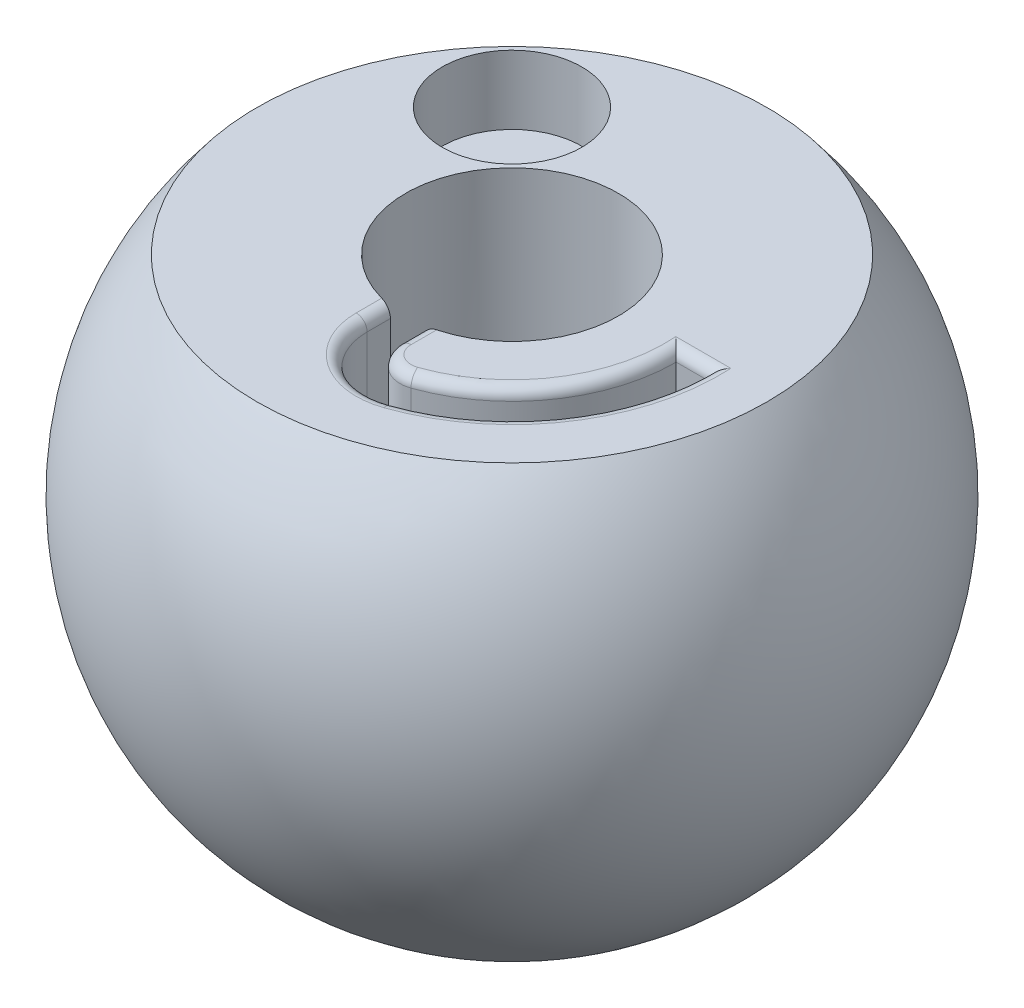
ISO-10303-21;
HEADER;
FILE_DESCRIPTION(('STEP AP214'),'2;1');
FILE_NAME('part.step','',(''),(''),'','','');
FILE_SCHEMA(('AUTOMOTIVE_DESIGN { 1 0 10303 214 1 1 1 1 }'));
ENDSEC;
DATA;
#1=APPLICATION_CONTEXT('core data for automotive mechanical design processes');
#2=APPLICATION_PROTOCOL_DEFINITION('international standard','automotive_design',2000,#1);
#3=PRODUCT_CONTEXT('',#1,'mechanical');
#4=PRODUCT('Part','Part','',(#3));
#5=PRODUCT_RELATED_PRODUCT_CATEGORY('part','',(#4));
#6=PRODUCT_DEFINITION_FORMATION('','',#4);
#7=PRODUCT_DEFINITION_CONTEXT('part definition',#1,'design');
#8=PRODUCT_DEFINITION('design','',#6,#7);
#9=PRODUCT_DEFINITION_SHAPE('','',#8);
#10=(LENGTH_UNIT() NAMED_UNIT(*) SI_UNIT(.MILLI.,.METRE.));
#11=(NAMED_UNIT(*) PLANE_ANGLE_UNIT() SI_UNIT($,.RADIAN.));
#12=(NAMED_UNIT(*) SI_UNIT($,.STERADIAN.) SOLID_ANGLE_UNIT());
#13=UNCERTAINTY_MEASURE_WITH_UNIT(LENGTH_MEASURE(1.E-05),#10,'distance_accuracy_value','');
#14=(GEOMETRIC_REPRESENTATION_CONTEXT(3) GLOBAL_UNCERTAINTY_ASSIGNED_CONTEXT((#13)) GLOBAL_UNIT_ASSIGNED_CONTEXT((#10,
#11,#12)) REPRESENTATION_CONTEXT('',''));
#15=CARTESIAN_POINT('',(0.,0.,0.));
#16=DIRECTION('',(0.,0.,1.));
#17=DIRECTION('',(1.,0.,0.));
#18=AXIS2_PLACEMENT_3D('',#15,#16,#17);
#19=CARTESIAN_POINT('',(0.,0.,0.));
#20=DIRECTION('',(0.,1.,0.));
#21=DIRECTION('',(1.,0.,0.));
#22=AXIS2_PLACEMENT_3D('',#19,#20,#21);
#23=SPHERICAL_SURFACE('',#22,38.1);
#24=CARTESIAN_POINT('',(0.,24.13,0.));
#25=DIRECTION('',(0.,1.,0.));
#26=DIRECTION('',(0.,0.,1.));
#27=AXIS2_PLACEMENT_3D('',#24,#25,#26);
#28=CIRCLE('',#27,29.4847943862595);
#29=CARTESIAN_POINT('',(0.,24.13,29.4847943862595));
#30=VERTEX_POINT('',#29);
#31=EDGE_CURVE('E187',#30,#30,#28,.T.);
#32=ORIENTED_EDGE('',*,*,#31,.F.);
#33=EDGE_LOOP('',(#32));
#34=FACE_BOUND('',#33,.T.);
#35=ADVANCED_FACE('F37',(#34),#23,.T.);
#36=CARTESIAN_POINT('',(0.,24.13,0.));
#37=DIRECTION('',(0.,1.,0.));
#38=DIRECTION('',(0.,0.,1.));
#39=AXIS2_PLACEMENT_3D('',#36,#37,#38);
#40=PLANE('',#39);
#41=CARTESIAN_POINT('',(5.17572632944708,24.13,14.84));
#42=DIRECTION('',(0.,1.,0.));
#43=DIRECTION('',(0.,0.,1.));
#44=AXIS2_PLACEMENT_3D('',#41,#42,#43);
#45=CIRCLE('',#44,8.35072632944708);
#46=CARTESIAN_POINT('',(7.92574091639115,24.13,22.7249254911455));
#47=VERTEX_POINT('',#46);
#48=CARTESIAN_POINT('',(-3.17499999999999,24.13,14.84));
#49=VERTEX_POINT('',#48);
#50=EDGE_CURVE('E205',#47,#49,#45,.F.);
#51=ORIENTED_EDGE('',*,*,#50,.T.);
#52=DIRECTION('',(0.,0.,1.));
#53=VECTOR('',#52,1.);
#54=CARTESIAN_POINT('',(-3.175,24.13,12.1515832301803));
#55=LINE('',#54,#53);
#56=CARTESIAN_POINT('',(-3.175,24.13,11.8831550945025));
#57=VERTEX_POINT('',#56);
#58=EDGE_CURVE('E207',#49,#57,#55,.F.);
#59=ORIENTED_EDGE('',*,*,#58,.T.);
#60=CARTESIAN_POINT('',(0.,24.13,0.));
#61=DIRECTION('',(0.,1.,0.));
#62=DIRECTION('',(0.,0.,1.));
#63=AXIS2_PLACEMENT_3D('',#60,#61,#62);
#64=CIRCLE('',#63,12.3);
#65=CARTESIAN_POINT('',(3.175,24.13,11.8831550945025));
#66=VERTEX_POINT('',#65);
#67=EDGE_CURVE('E181',#66,#57,#64,.T.);
#68=ORIENTED_EDGE('',*,*,#67,.F.);
#69=DIRECTION('',(0.,0.,1.));
#70=VECTOR('',#69,1.);
#71=CARTESIAN_POINT('',(3.175,24.13,14.84));
#72=LINE('',#71,#70);
#73=CARTESIAN_POINT('',(3.17500000000001,24.13,14.84));
#74=VERTEX_POINT('',#73);
#75=EDGE_CURVE('E203',#66,#74,#72,.T.);
#76=ORIENTED_EDGE('',*,*,#75,.T.);
#77=CARTESIAN_POINT('',(5.17572632944708,24.13,14.84));
#78=DIRECTION('',(0.,1.,0.));
#79=DIRECTION('',(0.,0.,1.));
#80=AXIS2_PLACEMENT_3D('',#77,#78,#79);
#81=CIRCLE('',#80,2.00072632944708);
#82=CARTESIAN_POINT('',(5.83459435761618,24.13,16.7291264560107));
#83=VERTEX_POINT('',#82);
#84=EDGE_CURVE('E201',#74,#83,#81,.T.);
#85=ORIENTED_EDGE('',*,*,#84,.T.);
#86=CARTESIAN_POINT('',(0.,24.13,0.));
#87=DIRECTION('',(0.,1.,0.));
#88=DIRECTION('',(0.,0.,1.));
#89=AXIS2_PLACEMENT_3D('',#86,#87,#88);
#90=CIRCLE('',#89,17.7173971931298);
#91=CARTESIAN_POINT('',(17.671821165322,24.13,-1.27));
#92=VERTEX_POINT('',#91);
#93=EDGE_CURVE('E197',#83,#92,#90,.T.);
#94=ORIENTED_EDGE('',*,*,#93,.T.);
#95=DIRECTION('',(1.,0.,0.));
#96=VECTOR('',#95,1.);
#97=CARTESIAN_POINT('',(22.7973971931298,24.13,-1.27));
#98=LINE('',#97,#96);
#99=CARTESIAN_POINT('',(24.0338658490862,24.13,-1.27));
#100=VERTEX_POINT('',#99);
#101=EDGE_CURVE('E195',#92,#100,#98,.T.);
#102=ORIENTED_EDGE('',*,*,#101,.T.);
#103=CARTESIAN_POINT('',(0.,24.13,0.));
#104=DIRECTION('',(0.,1.,0.));
#105=DIRECTION('',(0.,0.,1.));
#106=AXIS2_PLACEMENT_3D('',#103,#104,#105);
#107=CIRCLE('',#106,24.0673971931298);
#108=EDGE_CURVE('E199',#100,#47,#107,.F.);
#109=ORIENTED_EDGE('',*,*,#108,.T.);
#110=EDGE_LOOP('',(#51,#59,#68,#76,#85,#94,#102,#109));
#111=FACE_BOUND('',#110,.T.);
#112=CARTESIAN_POINT('',(-14.7731557305048,24.13,-14.7731557305049));
#113=DIRECTION('',(0.,1.,0.));
#114=DIRECTION('',(0.,0.,1.));
#115=AXIS2_PLACEMENT_3D('',#112,#113,#114);
#116=CIRCLE('',#115,8.0645);
#117=CARTESIAN_POINT('',(-14.7731557305048,24.13,-6.70865573050486));
#118=VERTEX_POINT('',#117);
#119=EDGE_CURVE('E174',#118,#118,#116,.T.);
#120=ORIENTED_EDGE('',*,*,#119,.F.);
#121=EDGE_LOOP('',(#120));
#122=FACE_BOUND('',#121,.T.);
#123=ORIENTED_EDGE('',*,*,#31,.T.);
#124=EDGE_LOOP('',(#123));
#125=FACE_BOUND('',#124,.T.);
#126=ADVANCED_FACE('F227',(#111,#122,#125),#40,.T.);
#127=CARTESIAN_POINT('',(0.,6.35,0.));
#128=DIRECTION('',(0.,1.,0.));
#129=DIRECTION('',(0.,0.,1.));
#130=AXIS2_PLACEMENT_3D('',#127,#128,#129);
#131=CYLINDRICAL_SURFACE('',#130,12.3);
#132=ORIENTED_EDGE('',*,*,#67,.T.);
#133=CARTESIAN_POINT('',(-3.175,24.13,11.8831550945025));
#134=CARTESIAN_POINT('',(-3.13911071709412,24.1299992060038,11.8927450827204));
#135=CARTESIAN_POINT('',(-3.10319288713873,24.1284776518995,11.9021664456396));
#136=CARTESIAN_POINT('',(-3.03151389522521,24.1223816549164,11.9206245892883));
#137=CARTESIAN_POINT('',(-2.99575275138904,24.1178068678246,11.929661326534));
#138=CARTESIAN_POINT('',(-2.88907431258439,24.0994924757014,11.9561112022107));
#139=CARTESIAN_POINT('',(-2.81872416163104,24.081162860669,11.9728740975207));
#140=CARTESIAN_POINT('',(-2.68171171912905,24.0325457329899,12.0043068286168));
#141=CARTESIAN_POINT('',(-2.61505424134754,24.00224301188,12.018973969947));
#142=CARTESIAN_POINT('',(-2.48761704489418,23.9303959302911,12.0459952962706));
#143=CARTESIAN_POINT('',(-2.42683364309002,23.8888586769224,12.0583509352192));
#144=CARTESIAN_POINT('',(-2.31436937383127,23.7966882788855,12.0804351816068));
#145=CARTESIAN_POINT('',(-2.26251634332743,23.7462776081674,12.0902160338392));
#146=CARTESIAN_POINT('',(-2.16794776906769,23.6371471648289,12.1075315421586));
#147=CARTESIAN_POINT('',(-2.12523419459412,23.5784256059775,12.1150657142899));
#148=CARTESIAN_POINT('',(-2.05106539128962,23.4555866773773,12.1278409198648));
#149=CARTESIAN_POINT('',(-2.01941092764803,23.3915936174816,12.133122958461));
#150=CARTESIAN_POINT('',(-1.96724790707428,23.2591150097818,12.1416901493077));
#151=CARTESIAN_POINT('',(-1.94673080191983,23.1906329527811,12.1449768332767));
#152=CARTESIAN_POINT('',(-1.9230879779729,23.0780424378322,12.1487371224857));
#153=CARTESIAN_POINT('',(-1.91630853304425,23.0346865958632,12.1498064509077));
#154=CARTESIAN_POINT('',(-1.90726581732743,22.9475603047554,12.1512280811042));
#155=CARTESIAN_POINT('',(-1.90499582916248,22.9037905700381,12.1515814494027));
#156=CARTESIAN_POINT('',(-1.905,22.86,12.1515832301803));
#157=B_SPLINE_CURVE_WITH_KNOTS('',3,(#133,#134,#135,#136,#137,#138,#139,#140,#141,#142,#143,
#144,#145,#146,#147,#148,#149,#150,#151,#152,#153,#154,#155,#156),.UNSPECIFIED.,.F.,.F.,(4,2,2,
2,2,2,2,2,2,2,2,4),(0.,0.111381039702721,0.222774638315608,0.445445781819968,0.668400680372017,
0.891214863338889,1.10908106550385,1.32699416422113,1.54075004005408,1.75434161968975,
1.88580829108639,2.01707897981791),.UNSPECIFIED.);
#158=CARTESIAN_POINT('',(-1.905,22.86,12.1515832301803));
#159=VERTEX_POINT('',#158);
#160=EDGE_CURVE('E215',#57,#159,#157,.T.);
#161=ORIENTED_EDGE('',*,*,#160,.T.);
#162=DIRECTION('',(0.,1.,0.));
#163=VECTOR('',#162,1.);
#164=CARTESIAN_POINT('',(-1.905,6.35,12.1515832301803));
#165=LINE('',#164,#163);
#166=CARTESIAN_POINT('',(-1.905,6.35,12.1515832301803));
#167=VERTEX_POINT('',#166);
#168=EDGE_CURVE('E171',#167,#159,#165,.T.);
#169=ORIENTED_EDGE('',*,*,#168,.F.);
#170=CARTESIAN_POINT('',(0.,6.35,0.));
#171=DIRECTION('',(0.,1.,0.));
#172=DIRECTION('',(0.,0.,1.));
#173=AXIS2_PLACEMENT_3D('',#170,#171,#172);
#174=CIRCLE('',#173,12.3);
#175=CARTESIAN_POINT('',(1.905,6.35,12.1515832301803));
#176=VERTEX_POINT('',#175);
#177=EDGE_CURVE('E184',#176,#167,#174,.T.);
#178=ORIENTED_EDGE('',*,*,#177,.F.);
#179=DIRECTION('',(0.,1.,0.));
#180=VECTOR('',#179,1.);
#181=CARTESIAN_POINT('',(1.905,6.35,12.1515832301803));
#182=LINE('',#181,#180);
#183=CARTESIAN_POINT('',(1.905,22.86,12.1515832301803));
#184=VERTEX_POINT('',#183);
#185=EDGE_CURVE('E163',#184,#176,#182,.F.);
#186=ORIENTED_EDGE('',*,*,#185,.F.);
#187=CARTESIAN_POINT('',(1.905,22.86,12.1515832301803));
#188=CARTESIAN_POINT('',(1.9050000267431,22.8953519852013,12.1515823340837));
#189=CARTESIAN_POINT('',(1.90647705113797,22.9306869935261,12.1513517731432));
#190=CARTESIAN_POINT('',(1.9123680855987,23.0011031338203,12.1504263886303));
#191=CARTESIAN_POINT('',(1.91678192761373,23.0361842802001,12.1497315916225));
#192=CARTESIAN_POINT('',(1.93438184372772,23.1405951426144,12.1469468232704));
#193=CARTESIAN_POINT('',(1.95192645204418,23.2092237513434,12.1441565044768));
#194=CARTESIAN_POINT('',(1.99811457266184,23.3425195527888,12.1366419975746));
#195=CARTESIAN_POINT('',(2.02676294710932,23.4071849957178,12.131916962236));
#196=CARTESIAN_POINT('',(2.09427854367581,23.5307410960806,12.1204440987509));
#197=CARTESIAN_POINT('',(2.1331443959076,23.589632526201,12.1136965417527));
#198=CARTESIAN_POINT('',(2.22002291310583,23.7001633989504,12.0980760980267));
#199=CARTESIAN_POINT('',(2.26806002488998,23.751782803301,12.0891975142084));
#200=CARTESIAN_POINT('',(2.37175080215875,23.8462089412832,12.0692824770453));
#201=CARTESIAN_POINT('',(2.4274054226253,23.8890145682729,12.0582457530673));
#202=CARTESIAN_POINT('',(2.54528740962974,23.9651423066289,12.0339174191401));
#203=CARTESIAN_POINT('',(2.60757928943223,23.9983569660407,12.020602736551));
#204=CARTESIAN_POINT('',(2.73639754522142,24.0539203313096,11.9919338142844));
#205=CARTESIAN_POINT('',(2.80292356276027,24.076269955584,11.9765797471351));
#206=CARTESIAN_POINT('',(2.9205920564805,24.1053242566742,11.9483382085892));
#207=CARTESIAN_POINT('',(2.97121719867836,24.1145899133892,11.9358530677808));
#208=CARTESIAN_POINT('',(3.07292220842009,24.1269273458906,11.9100769562943));
#209=CARTESIAN_POINT('',(3.12400115500941,24.1300096403678,11.8967873937939));
#210=CARTESIAN_POINT('',(3.175,24.13,11.8831550945025));
#211=B_SPLINE_CURVE_WITH_KNOTS('',3,(#187,#188,#189,#190,#191,#192,#193,#194,#195,#196,#197,
#198,#199,#200,#201,#202,#203,#204,#205,#206,#207,#208,#209,#210),.UNSPECIFIED.,.F.,.F.,(4,2,2,
2,2,2,2,2,2,2,2,4),(0.,0.105990657898279,0.211975251310806,0.423555062819125,0.635227626311494,
0.846871824702948,1.05908826183689,1.27133132825567,1.4858673770892,1.70038528811844,
1.85890715545324,2.01715912733958),.UNSPECIFIED.);
#212=EDGE_CURVE('E209',#184,#66,#211,.T.);
#213=ORIENTED_EDGE('',*,*,#212,.T.);
#214=EDGE_LOOP('',(#132,#161,#169,#178,#186,#213));
#215=FACE_BOUND('',#214,.T.);
#216=ADVANCED_FACE('F221',(#215),#131,.F.);
#217=CARTESIAN_POINT('',(0.,6.35,0.));
#218=DIRECTION('',(0.,1.,0.));
#219=DIRECTION('',(0.,0.,1.));
#220=AXIS2_PLACEMENT_3D('',#217,#218,#219);
#221=PLANE('',#220);
#222=ORIENTED_EDGE('',*,*,#177,.T.);
#223=DIRECTION('',(0.,0.,1.));
#224=VECTOR('',#223,1.);
#225=CARTESIAN_POINT('',(-1.905,6.35,10.596571769572));
#226=LINE('',#225,#224);
#227=CARTESIAN_POINT('',(-1.905,6.35,14.84));
#228=VERTEX_POINT('',#227);
#229=EDGE_CURVE('E139',#167,#228,#226,.T.);
#230=ORIENTED_EDGE('',*,*,#229,.T.);
#231=DIRECTION('',(1.,0.,0.));
#232=VECTOR('',#231,1.);
#233=CARTESIAN_POINT('',(1.905,6.35,14.84));
#234=LINE('',#233,#232);
#235=CARTESIAN_POINT('',(1.905,6.35,14.84));
#236=VERTEX_POINT('',#235);
#237=EDGE_CURVE('E153',#228,#236,#234,.T.);
#238=ORIENTED_EDGE('',*,*,#237,.T.);
#239=DIRECTION('',(0.,0.,1.));
#240=VECTOR('',#239,1.);
#241=CARTESIAN_POINT('',(1.905,6.35,10.596571769572));
#242=LINE('',#241,#240);
#243=EDGE_CURVE('E169',#176,#236,#242,.T.);
#244=ORIENTED_EDGE('',*,*,#243,.F.);
#245=EDGE_LOOP('',(#222,#230,#238,#244));
#246=FACE_BOUND('',#245,.T.);
#247=ADVANCED_FACE('F226',(#246),#221,.T.);
#248=CARTESIAN_POINT('',(-14.7731557305048,16.1925,-14.7731557305049));
#249=DIRECTION('',(0.,1.,0.));
#250=DIRECTION('',(0.,0.,1.));
#251=AXIS2_PLACEMENT_3D('',#248,#249,#250);
#252=CYLINDRICAL_SURFACE('',#251,8.0645);
#253=CARTESIAN_POINT('',(-14.7731557305048,16.1925,-14.7731557305049));
#254=DIRECTION('',(0.,1.,0.));
#255=DIRECTION('',(0.,0.,1.));
#256=AXIS2_PLACEMENT_3D('',#253,#254,#255);
#257=CIRCLE('',#256,8.0645);
#258=CARTESIAN_POINT('',(-14.7731557305048,16.1925,-6.70865573050486));
#259=VERTEX_POINT('',#258);
#260=EDGE_CURVE('E178',#259,#259,#257,.T.);
#261=ORIENTED_EDGE('',*,*,#260,.F.);
#262=EDGE_LOOP('',(#261));
#263=FACE_BOUND('',#262,.T.);
#264=ORIENTED_EDGE('',*,*,#119,.T.);
#265=EDGE_LOOP('',(#264));
#266=FACE_BOUND('',#265,.T.);
#267=ADVANCED_FACE('F450',(#263,#266),#252,.F.);
#268=CARTESIAN_POINT('',(0.,16.1925,0.));
#269=DIRECTION('',(0.,1.,0.));
#270=DIRECTION('',(0.,0.,1.));
#271=AXIS2_PLACEMENT_3D('',#268,#269,#270);
#272=PLANE('',#271);
#273=ORIENTED_EDGE('',*,*,#260,.T.);
#274=EDGE_LOOP('',(#273));
#275=FACE_BOUND('',#274,.T.);
#276=ADVANCED_FACE('F378',(#275),#272,.T.);
#277=CARTESIAN_POINT('',(20.8923971931298,0.,0.));
#278=DIRECTION('',(0.,0.,-1.));
#279=DIRECTION('',(-1.,0.,0.));
#280=AXIS2_PLACEMENT_3D('',#277,#278,#279);
#281=PLANE('',#280);
#282=DIRECTION('',(0.,-1.,0.));
#283=VECTOR('',#282,1.);
#284=CARTESIAN_POINT('',(22.7973971931298,6.35,0.));
#285=LINE('',#284,#283);
#286=CARTESIAN_POINT('',(22.7973971931298,22.86,0.));
#287=VERTEX_POINT('',#286);
#288=CARTESIAN_POINT('',(22.7973971931298,6.35,0.));
#289=VERTEX_POINT('',#288);
#290=EDGE_CURVE('E127',#287,#289,#285,.T.);
#291=ORIENTED_EDGE('',*,*,#290,.F.);
#292=DIRECTION('',(1.,0.,0.));
#293=VECTOR('',#292,1.);
#294=CARTESIAN_POINT('',(18.9873971931298,22.86,0.));
#295=LINE('',#294,#293);
#296=CARTESIAN_POINT('',(18.9873971931298,22.86,0.));
#297=VERTEX_POINT('',#296);
#298=EDGE_CURVE('E11',#287,#297,#295,.F.);
#299=ORIENTED_EDGE('',*,*,#298,.T.);
#300=DIRECTION('',(0.,1.,0.));
#301=VECTOR('',#300,1.);
#302=CARTESIAN_POINT('',(18.9873971931298,6.35,0.));
#303=LINE('',#302,#301);
#304=CARTESIAN_POINT('',(18.9873971931298,6.35,0.));
#305=VERTEX_POINT('',#304);
#306=EDGE_CURVE('E134',#305,#297,#303,.T.);
#307=ORIENTED_EDGE('',*,*,#306,.F.);
#308=DIRECTION('',(-1.,0.,0.));
#309=VECTOR('',#308,1.);
#310=CARTESIAN_POINT('',(18.9873971931298,6.35,0.));
#311=LINE('',#310,#309);
#312=EDGE_CURVE('E133',#289,#305,#311,.T.);
#313=ORIENTED_EDGE('',*,*,#312,.F.);
#314=EDGE_LOOP('',(#291,#299,#307,#313));
#315=FACE_BOUND('',#314,.T.);
#316=ADVANCED_FACE('F136',(#315),#281,.F.);
#317=CARTESIAN_POINT('',(1.905,6.35,10.596571769572));
#318=DIRECTION('',(1.,0.,0.));
#319=DIRECTION('',(0.,0.,-1.));
#320=AXIS2_PLACEMENT_3D('',#317,#318,#319);
#321=PLANE('',#320);
#322=DIRECTION('',(0.,1.,0.));
#323=VECTOR('',#322,1.);
#324=CARTESIAN_POINT('',(1.905,6.35,14.84));
#325=LINE('',#324,#323);
#326=CARTESIAN_POINT('',(1.905,22.86,14.84));
#327=VERTEX_POINT('',#326);
#328=EDGE_CURVE('E158',#236,#327,#325,.T.);
#329=ORIENTED_EDGE('',*,*,#328,.T.);
#330=DIRECTION('',(0.,0.,1.));
#331=VECTOR('',#330,1.);
#332=CARTESIAN_POINT('',(1.905,22.86,12.1515832301803));
#333=LINE('',#332,#331);
#334=EDGE_CURVE('E297',#327,#184,#333,.F.);
#335=ORIENTED_EDGE('',*,*,#334,.T.);
#336=ORIENTED_EDGE('',*,*,#185,.T.);
#337=ORIENTED_EDGE('',*,*,#243,.T.);
#338=EDGE_LOOP('',(#329,#335,#336,#337));
#339=FACE_BOUND('',#338,.T.);
#340=ADVANCED_FACE('F304',(#339),#321,.F.);
#341=CARTESIAN_POINT('',(-1.905,6.35,10.596571769572));
#342=DIRECTION('',(-1.,0.,0.));
#343=DIRECTION('',(0.,0.,1.));
#344=AXIS2_PLACEMENT_3D('',#341,#342,#343);
#345=PLANE('',#344);
#346=ORIENTED_EDGE('',*,*,#168,.T.);
#347=DIRECTION('',(0.,0.,1.));
#348=VECTOR('',#347,1.);
#349=CARTESIAN_POINT('',(-1.905,22.86,14.84));
#350=LINE('',#349,#348);
#351=CARTESIAN_POINT('',(-1.905,22.86,14.84));
#352=VERTEX_POINT('',#351);
#353=EDGE_CURVE('E192',#159,#352,#350,.T.);
#354=ORIENTED_EDGE('',*,*,#353,.T.);
#355=DIRECTION('',(0.,-1.,0.));
#356=VECTOR('',#355,1.);
#357=CARTESIAN_POINT('',(-1.905,6.35,14.84));
#358=LINE('',#357,#356);
#359=EDGE_CURVE('E157',#352,#228,#358,.T.);
#360=ORIENTED_EDGE('',*,*,#359,.T.);
#361=ORIENTED_EDGE('',*,*,#229,.F.);
#362=EDGE_LOOP('',(#346,#354,#360,#361));
#363=FACE_BOUND('',#362,.T.);
#364=ADVANCED_FACE('F419',(#363),#345,.F.);
#365=CARTESIAN_POINT('',(5.17572632944708,24.13,14.84));
#366=DIRECTION('',(0.,1.,0.));
#367=DIRECTION('',(0.,0.,1.));
#368=AXIS2_PLACEMENT_3D('',#365,#366,#367);
#369=CYLINDRICAL_SURFACE('',#368,3.27072632944708);
#370=DIRECTION('',(0.,1.,0.));
#371=VECTOR('',#370,1.);
#372=CARTESIAN_POINT('',(6.25282366937117,6.35,17.9282862630376));
#373=LINE('',#372,#371);
#374=CARTESIAN_POINT('',(6.25282366937117,6.35,17.9282862630376));
#375=VERTEX_POINT('',#374);
#376=CARTESIAN_POINT('',(6.25282366937117,22.86,17.9282862630376));
#377=VERTEX_POINT('',#376);
#378=EDGE_CURVE('E146',#375,#377,#373,.T.);
#379=ORIENTED_EDGE('',*,*,#378,.T.);
#380=CARTESIAN_POINT('',(5.17572632944708,22.86,14.84));
#381=DIRECTION('',(0.,1.,0.));
#382=DIRECTION('',(0.,0.,1.));
#383=AXIS2_PLACEMENT_3D('',#380,#381,#382);
#384=CIRCLE('',#383,3.27072632944708);
#385=EDGE_CURVE('E285',#377,#327,#384,.F.);
#386=ORIENTED_EDGE('',*,*,#385,.T.);
#387=ORIENTED_EDGE('',*,*,#328,.F.);
#388=CARTESIAN_POINT('',(5.17572632944708,6.35,14.84));
#389=DIRECTION('',(0.,1.,0.));
#390=DIRECTION('',(-1.,0.,0.));
#391=AXIS2_PLACEMENT_3D('',#388,#389,#390);
#392=CIRCLE('',#391,3.27072632944708);
#393=EDGE_CURVE('E150',#236,#375,#392,.T.);
#394=ORIENTED_EDGE('',*,*,#393,.T.);
#395=EDGE_LOOP('',(#379,#386,#387,#394));
#396=FACE_BOUND('',#395,.T.);
#397=ADVANCED_FACE('F313',(#396),#369,.T.);
#398=CARTESIAN_POINT('',(5.17572632944708,24.13,14.84));
#399=DIRECTION('',(0.,1.,0.));
#400=DIRECTION('',(0.,0.,1.));
#401=AXIS2_PLACEMENT_3D('',#398,#399,#400);
#402=CYLINDRICAL_SURFACE('',#401,7.08072632944708);
#403=ORIENTED_EDGE('',*,*,#359,.F.);
#404=CARTESIAN_POINT('',(5.17572632944708,22.86,14.84));
#405=DIRECTION('',(0.,1.,0.));
#406=DIRECTION('',(0.,0.,1.));
#407=AXIS2_PLACEMENT_3D('',#404,#405,#406);
#408=CIRCLE('',#407,7.08072632944708);
#409=CARTESIAN_POINT('',(7.50751160463616,22.86,21.5257656841185));
#410=VERTEX_POINT('',#409);
#411=EDGE_CURVE('E317',#352,#410,#408,.T.);
#412=ORIENTED_EDGE('',*,*,#411,.T.);
#413=DIRECTION('',(0.,-1.,0.));
#414=VECTOR('',#413,1.);
#415=CARTESIAN_POINT('',(7.50751160463616,6.35,21.5257656841185));
#416=LINE('',#415,#414);
#417=CARTESIAN_POINT('',(7.50751160463616,6.35,21.5257656841185));
#418=VERTEX_POINT('',#417);
#419=EDGE_CURVE('E145',#410,#418,#416,.T.);
#420=ORIENTED_EDGE('',*,*,#419,.T.);
#421=CARTESIAN_POINT('',(5.17572632944708,6.35,14.84));
#422=DIRECTION('',(0.,1.,0.));
#423=DIRECTION('',(-1.,0.,0.));
#424=AXIS2_PLACEMENT_3D('',#421,#422,#423);
#425=CIRCLE('',#424,7.08072632944708);
#426=EDGE_CURVE('E156',#228,#418,#425,.T.);
#427=ORIENTED_EDGE('',*,*,#426,.F.);
#428=EDGE_LOOP('',(#403,#412,#420,#427));
#429=FACE_BOUND('',#428,.T.);
#430=ADVANCED_FACE('F403',(#429),#402,.F.);
#431=CARTESIAN_POINT('',(1.90500000000001,6.35,14.84));
#432=DIRECTION('',(0.,-1.,0.));
#433=DIRECTION('',(0.,0.,-1.));
#434=AXIS2_PLACEMENT_3D('',#431,#432,#433);
#435=PLANE('',#434);
#436=DIRECTION('',(-0.329314418704721,0.,-0.944220320493671));
#437=VECTOR('',#436,1.);
#438=CARTESIAN_POINT('',(6.25282366937117,6.35,17.9282862630376));
#439=LINE('',#438,#437);
#440=EDGE_CURVE('E143',#418,#375,#439,.T.);
#441=ORIENTED_EDGE('',*,*,#440,.T.);
#442=ORIENTED_EDGE('',*,*,#393,.F.);
#443=ORIENTED_EDGE('',*,*,#237,.F.);
#444=ORIENTED_EDGE('',*,*,#426,.T.);
#445=EDGE_LOOP('',(#441,#442,#443,#444));
#446=FACE_BOUND('',#445,.T.);
#447=ADVANCED_FACE('F394',(#446),#435,.F.);
#448=CARTESIAN_POINT('',(0.,24.13,0.));
#449=DIRECTION('',(0.,1.,0.));
#450=DIRECTION('',(0.,0.,1.));
#451=AXIS2_PLACEMENT_3D('',#448,#449,#450);
#452=CYLINDRICAL_SURFACE('',#451,18.9873971931298);
#453=ORIENTED_EDGE('',*,*,#306,.T.);
#454=CARTESIAN_POINT('',(0.,22.86,0.));
#455=DIRECTION('',(0.,1.,0.));
#456=DIRECTION('',(0.,0.,1.));
#457=AXIS2_PLACEMENT_3D('',#454,#455,#456);
#458=CIRCLE('',#457,18.9873971931298);
#459=EDGE_CURVE('E47',#297,#377,#458,.F.);
#460=ORIENTED_EDGE('',*,*,#459,.T.);
#461=ORIENTED_EDGE('',*,*,#378,.F.);
#462=CARTESIAN_POINT('',(0.,6.35,0.));
#463=DIRECTION('',(0.,1.,0.));
#464=DIRECTION('',(0.329314418704721,0.,0.944220320493672));
#465=AXIS2_PLACEMENT_3D('',#462,#463,#464);
#466=CIRCLE('',#465,18.9873971931298);
#467=EDGE_CURVE('E161',#375,#305,#466,.T.);
#468=ORIENTED_EDGE('',*,*,#467,.T.);
#469=EDGE_LOOP('',(#453,#460,#461,#468));
#470=FACE_BOUND('',#469,.T.);
#471=ADVANCED_FACE('F386',(#470),#452,.T.);
#472=CARTESIAN_POINT('',(0.,24.13,0.));
#473=DIRECTION('',(0.,1.,0.));
#474=DIRECTION('',(0.,0.,1.));
#475=AXIS2_PLACEMENT_3D('',#472,#473,#474);
#476=CYLINDRICAL_SURFACE('',#475,22.7973971931298);
#477=ORIENTED_EDGE('',*,*,#419,.F.);
#478=CARTESIAN_POINT('',(0.,22.86,0.));
#479=DIRECTION('',(0.,1.,0.));
#480=DIRECTION('',(0.,0.,1.));
#481=AXIS2_PLACEMENT_3D('',#478,#479,#480);
#482=CIRCLE('',#481,22.7973971931298);
#483=EDGE_CURVE('E61',#410,#287,#482,.T.);
#484=ORIENTED_EDGE('',*,*,#483,.T.);
#485=ORIENTED_EDGE('',*,*,#290,.T.);
#486=CARTESIAN_POINT('',(0.,6.35,0.));
#487=DIRECTION('',(0.,1.,0.));
#488=DIRECTION('',(0.329314418704721,0.,0.944220320493672));
#489=AXIS2_PLACEMENT_3D('',#486,#487,#488);
#490=CIRCLE('',#489,22.7973971931298);
#491=EDGE_CURVE('E131',#418,#289,#490,.T.);
#492=ORIENTED_EDGE('',*,*,#491,.F.);
#493=EDGE_LOOP('',(#477,#484,#485,#492));
#494=FACE_BOUND('',#493,.T.);
#495=ADVANCED_FACE('F129',(#494),#476,.F.);
#496=CARTESIAN_POINT('',(6.25282366937117,6.35,17.9282862630376));
#497=DIRECTION('',(0.,-1.,0.));
#498=DIRECTION('',(0.,0.,-1.));
#499=AXIS2_PLACEMENT_3D('',#496,#497,#498);
#500=PLANE('',#499);
#501=ORIENTED_EDGE('',*,*,#312,.T.);
#502=ORIENTED_EDGE('',*,*,#467,.F.);
#503=ORIENTED_EDGE('',*,*,#440,.F.);
#504=ORIENTED_EDGE('',*,*,#491,.T.);
#505=EDGE_LOOP('',(#501,#502,#503,#504));
#506=FACE_BOUND('',#505,.T.);
#507=ADVANCED_FACE('F141',(#506),#500,.F.);
#508=CARTESIAN_POINT('',(3.175,22.86,0.));
#509=DIRECTION('',(0.,0.,-1.));
#510=DIRECTION('',(-1.,0.,0.));
#511=AXIS2_PLACEMENT_3D('',#508,#509,#510);
#512=CYLINDRICAL_SURFACE('',#511,1.27);
#513=ORIENTED_EDGE('',*,*,#212,.F.);
#514=ORIENTED_EDGE('',*,*,#334,.F.);
#515=CARTESIAN_POINT('',(3.175,22.86,14.84));
#516=DIRECTION('',(0.,0.,1.));
#517=DIRECTION('',(1.,0.,0.));
#518=AXIS2_PLACEMENT_3D('',#515,#516,#517);
#519=CIRCLE('',#518,1.27);
#520=EDGE_CURVE('E42',#74,#327,#519,.T.);
#521=ORIENTED_EDGE('',*,*,#520,.F.);
#522=ORIENTED_EDGE('',*,*,#75,.F.);
#523=EDGE_LOOP('',(#513,#514,#521,#522));
#524=FACE_BOUND('',#523,.T.);
#525=ADVANCED_FACE('F39',(#524),#512,.T.);
#526=CARTESIAN_POINT('',(5.17572632944708,22.86,14.84));
#527=DIRECTION('',(0.,1.,0.));
#528=DIRECTION('',(0.,0.,1.));
#529=AXIS2_PLACEMENT_3D('',#526,#527,#528);
#530=TOROIDAL_SURFACE('',#529,2.00072632944708,1.27);
#531=ORIENTED_EDGE('',*,*,#520,.T.);
#532=ORIENTED_EDGE('',*,*,#385,.F.);
#533=CARTESIAN_POINT('',(5.83459435761618,22.86,16.7291264560107));
#534=DIRECTION('',(0.944220320493672,0.,-0.329314418704721));
#535=DIRECTION('',(-0.329314418704721,0.,-0.944220320493672));
#536=AXIS2_PLACEMENT_3D('',#533,#534,#535);
#537=CIRCLE('',#536,1.27);
#538=EDGE_CURVE('E268',#83,#377,#537,.T.);
#539=ORIENTED_EDGE('',*,*,#538,.F.);
#540=ORIENTED_EDGE('',*,*,#84,.F.);
#541=EDGE_LOOP('',(#531,#532,#539,#540));
#542=FACE_BOUND('',#541,.T.);
#543=ADVANCED_FACE('F272',(#542),#530,.T.);
#544=CARTESIAN_POINT('',(0.,22.86,0.));
#545=DIRECTION('',(0.,1.,0.));
#546=DIRECTION('',(0.,0.,1.));
#547=AXIS2_PLACEMENT_3D('',#544,#545,#546);
#548=TOROIDAL_SURFACE('',#547,17.7173971931298,1.27);
#549=ORIENTED_EDGE('',*,*,#538,.T.);
#550=ORIENTED_EDGE('',*,*,#459,.F.);
#551=CARTESIAN_POINT('',(18.9873971931298,22.86,0.));
#552=CARTESIAN_POINT('',(18.9874007370644,22.888405745489,3.78293667143684E-06));
#553=CARTESIAN_POINT('',(18.9864433522526,22.9167940754908,-0.000953861137124989));
#554=CARTESIAN_POINT('',(18.9826491005493,22.9732974966723,-0.00474764430152427));
#555=CARTESIAN_POINT('',(18.9798136513243,23.0014127777341,-0.00758236646969803));
#556=CARTESIAN_POINT('',(18.9686207313177,23.0845419483359,-0.0187686985222716));
#557=CARTESIAN_POINT('',(18.9575749065734,23.1388707989933,-0.0298043237281321));
#558=CARTESIAN_POINT('',(18.9291347164449,23.2438589036213,-0.0581782809540223));
#559=CARTESIAN_POINT('',(18.9117570845347,23.2945274119309,-0.0754999998301315));
#560=CARTESIAN_POINT('',(18.8716509765131,23.3915720824724,-0.115404048620228));
#561=CARTESIAN_POINT('',(18.8489108168752,23.4379385599225,-0.137997863890529));
#562=CARTESIAN_POINT('',(18.7891413554178,23.5434441033294,-0.197252547706977));
#563=CARTESIAN_POINT('',(18.7500348259941,23.6002735450758,-0.235925223293392));
#564=CARTESIAN_POINT('',(18.6657123830973,23.7043733366941,-0.319006939124556));
#565=CARTESIAN_POINT('',(18.6204851183491,23.7516255083031,-0.363426630661311));
#566=CARTESIAN_POINT('',(18.5067136979649,23.8540872654944,-0.474714335369284));
#567=CARTESIAN_POINT('',(18.4360771427366,23.9049241232384,-0.543456566872463));
#568=CARTESIAN_POINT('',(18.2895337129754,23.9903755205175,-0.685180976386661));
#569=CARTESIAN_POINT('',(18.2136195679481,24.024967150776,-0.758168979920052));
#570=CARTESIAN_POINT('',(18.0615937912256,24.0782936140833,-0.903379352168264));
#571=CARTESIAN_POINT('',(17.9855984518367,24.0975792062648,-0.975526086961358));
#572=CARTESIAN_POINT('',(17.8321389504941,24.1232768688688,-1.12026796110901));
#573=CARTESIAN_POINT('',(17.7546779745431,24.1297142071312,-1.19286193815141));
#574=CARTESIAN_POINT('',(17.6753037234187,24.1299968923396,-1.26675849900523));
#575=CARTESIAN_POINT('',(17.6735624840801,24.1299999943247,-1.26837933304144));
#576=CARTESIAN_POINT('',(17.671821165322,24.13,-1.27));
#577=B_SPLINE_CURVE_WITH_KNOTS('',3,(#551,#552,#553,#554,#555,#556,#557,#558,#559,#560,#561,
#562,#563,#564,#565,#566,#567,#568,#569,#570,#571,#572,#573,#574,#575,#576),.UNSPECIFIED.,.F.,
.F.,(4,2,2,2,2,2,2,2,2,2,2,2,4),(0.,0.0851519882739982,0.170239772277207,0.338845381450941,
0.507008599809546,0.675541642610181,0.911488063444879,1.14787821594738,1.47878755682312,
1.81016216029618,2.12899082797077,2.44719185540382,2.4543284583268),.UNSPECIFIED.);
#578=EDGE_CURVE('E261',#92,#297,#577,.F.);
#579=ORIENTED_EDGE('',*,*,#578,.F.);
#580=ORIENTED_EDGE('',*,*,#93,.F.);
#581=EDGE_LOOP('',(#549,#550,#579,#580));
#582=FACE_BOUND('',#581,.T.);
#583=ADVANCED_FACE('F269',(#582),#548,.T.);
#584=CARTESIAN_POINT('',(0.,22.86,-1.27));
#585=DIRECTION('',(-1.,0.,0.));
#586=DIRECTION('',(0.,0.,1.));
#587=AXIS2_PLACEMENT_3D('',#584,#585,#586);
#588=CYLINDRICAL_SURFACE('',#587,1.27);
#589=ORIENTED_EDGE('',*,*,#578,.T.);
#590=ORIENTED_EDGE('',*,*,#298,.F.);
#591=CARTESIAN_POINT('',(22.7973971931298,22.86,0.));
#592=CARTESIAN_POINT('',(22.7973930913337,22.888557154362,3.89778904556557E-06));
#593=CARTESIAN_POINT('',(22.7983612510902,22.9170965484896,-0.000964041321584362));
#594=CARTESIAN_POINT('',(22.8021949551056,22.9738967102072,-0.00479814263287264));
#595=CARTESIAN_POINT('',(22.8050589708269,23.0021576836604,-0.00766277562094575));
#596=CARTESIAN_POINT('',(22.8163542583122,23.0856930550793,-0.0189636611189592));
#597=CARTESIAN_POINT('',(22.8274907959345,23.1402729573706,-0.0301088657396105));
#598=CARTESIAN_POINT('',(22.8560858170935,23.2457263973306,-0.0587597991354764));
#599=CARTESIAN_POINT('',(22.8735262773398,23.2966100097595,-0.0762473951143574));
#600=CARTESIAN_POINT('',(22.9136659415269,23.3940958492445,-0.116556371126068));
#601=CARTESIAN_POINT('',(22.9363772870457,23.4406878389279,-0.139390067085037));
#602=CARTESIAN_POINT('',(22.9962488669311,23.5473827865067,-0.19969218593883));
#603=CARTESIAN_POINT('',(23.0354989740975,23.6050974424614,-0.23930643527726));
#604=CARTESIAN_POINT('',(23.1198565262512,23.7108510898169,-0.324700562138554));
#605=CARTESIAN_POINT('',(23.1649751584656,23.7588711422946,-0.370492222079736));
#606=CARTESIAN_POINT('',(23.2768328879653,23.8617989262093,-0.484385662942397));
#607=CARTESIAN_POINT('',(23.3453594762233,23.9125956638551,-0.554438533085489));
#608=CARTESIAN_POINT('',(23.4868144033788,23.9978930730202,-0.699731340243417));
#609=CARTESIAN_POINT('',(23.5597471994954,24.0323769206531,-0.774976541020698));
#610=CARTESIAN_POINT('',(23.6986862714233,24.0826112523876,-0.919012648606773));
#611=CARTESIAN_POINT('',(23.7644304035118,24.1001541009361,-0.987447335929897));
#612=CARTESIAN_POINT('',(23.8965026885774,24.1236890369018,-1.12550514726392));
#613=CARTESIAN_POINT('',(23.9628293026567,24.1297056034607,-1.19512543514683));
#614=CARTESIAN_POINT('',(24.0305934728537,24.1299964827821,-1.26655031407326));
#615=CARTESIAN_POINT('',(24.0322297260825,24.1299999965523,-1.26827513703121));
#616=CARTESIAN_POINT('',(24.0338658490862,24.13,-1.27));
#617=B_SPLINE_CURVE_WITH_KNOTS('',3,(#591,#592,#593,#594,#595,#596,#597,#598,#599,#600,#601,
#602,#603,#604,#605,#606,#607,#608,#609,#610,#611,#612,#613,#614,#615,#616),.UNSPECIFIED.,.F.,
.F.,(4,2,2,2,2,2,2,2,2,2,2,2,4),(0.,0.0856051345988069,0.171141333824347,0.340580741929705,
0.509539495634963,0.678891381127775,0.918329011415897,1.15822996357206,1.48760664265385,
1.8173222794353,2.10616447770414,2.39439255933,2.40152494924656),.UNSPECIFIED.);
#618=EDGE_CURVE('E254',#100,#287,#617,.F.);
#619=ORIENTED_EDGE('',*,*,#618,.F.);
#620=ORIENTED_EDGE('',*,*,#101,.F.);
#621=EDGE_LOOP('',(#589,#590,#619,#620));
#622=FACE_BOUND('',#621,.T.);
#623=ADVANCED_FACE('F249',(#622),#588,.T.);
#624=CARTESIAN_POINT('',(0.,22.86,0.));
#625=DIRECTION('',(0.,1.,0.));
#626=DIRECTION('',(0.,0.,1.));
#627=AXIS2_PLACEMENT_3D('',#624,#625,#626);
#628=TOROIDAL_SURFACE('',#627,24.0673971931298,1.27);
#629=ORIENTED_EDGE('',*,*,#618,.T.);
#630=ORIENTED_EDGE('',*,*,#483,.F.);
#631=CARTESIAN_POINT('',(7.92574091639115,22.86,22.7249254911455));
#632=DIRECTION('',(-0.944220320493672,0.,0.329314418704721));
#633=DIRECTION('',(0.329314418704721,0.,0.944220320493672));
#634=AXIS2_PLACEMENT_3D('',#631,#632,#633);
#635=CIRCLE('',#634,1.27);
#636=EDGE_CURVE('E262',#47,#410,#635,.T.);
#637=ORIENTED_EDGE('',*,*,#636,.F.);
#638=ORIENTED_EDGE('',*,*,#108,.F.);
#639=EDGE_LOOP('',(#629,#630,#637,#638));
#640=FACE_BOUND('',#639,.T.);
#641=ADVANCED_FACE('F244',(#640),#628,.T.);
#642=CARTESIAN_POINT('',(5.17572632944708,22.86,14.84));
#643=DIRECTION('',(0.,1.,0.));
#644=DIRECTION('',(0.,0.,1.));
#645=AXIS2_PLACEMENT_3D('',#642,#643,#644);
#646=TOROIDAL_SURFACE('',#645,8.35072632944708,1.27);
#647=ORIENTED_EDGE('',*,*,#636,.T.);
#648=ORIENTED_EDGE('',*,*,#411,.F.);
#649=CARTESIAN_POINT('',(-3.17499999999999,22.86,14.84));
#650=DIRECTION('',(0.,0.,-1.));
#651=DIRECTION('',(-1.,0.,0.));
#652=AXIS2_PLACEMENT_3D('',#649,#650,#651);
#653=CIRCLE('',#652,1.27);
#654=EDGE_CURVE('E320',#49,#352,#653,.T.);
#655=ORIENTED_EDGE('',*,*,#654,.F.);
#656=ORIENTED_EDGE('',*,*,#50,.F.);
#657=EDGE_LOOP('',(#647,#648,#655,#656));
#658=FACE_BOUND('',#657,.T.);
#659=ADVANCED_FACE('F240',(#658),#646,.T.);
#660=CARTESIAN_POINT('',(-3.175,22.86,10.596571769572));
#661=DIRECTION('',(0.,0.,-1.));
#662=DIRECTION('',(-1.,0.,0.));
#663=AXIS2_PLACEMENT_3D('',#660,#661,#662);
#664=CYLINDRICAL_SURFACE('',#663,1.27);
#665=ORIENTED_EDGE('',*,*,#160,.F.);
#666=ORIENTED_EDGE('',*,*,#58,.F.);
#667=ORIENTED_EDGE('',*,*,#654,.T.);
#668=ORIENTED_EDGE('',*,*,#353,.F.);
#669=EDGE_LOOP('',(#665,#666,#667,#668));
#670=FACE_BOUND('',#669,.T.);
#671=ADVANCED_FACE('F236',(#670),#664,.T.);
#672=CLOSED_SHELL('',(#35,#126,#216,#247,#267,#276,#316,#340,#364,#397,#430,#447,#471,#495,#507,
#525,#543,#583,#623,#641,#659,#671));
#673=MANIFOLD_SOLID_BREP('B2',#672);
#674=ADVANCED_BREP_SHAPE_REPRESENTATION('',(#18,#673),#14);
#675=SHAPE_DEFINITION_REPRESENTATION(#9,#674);
ENDSEC;
END-ISO-10303-21;
